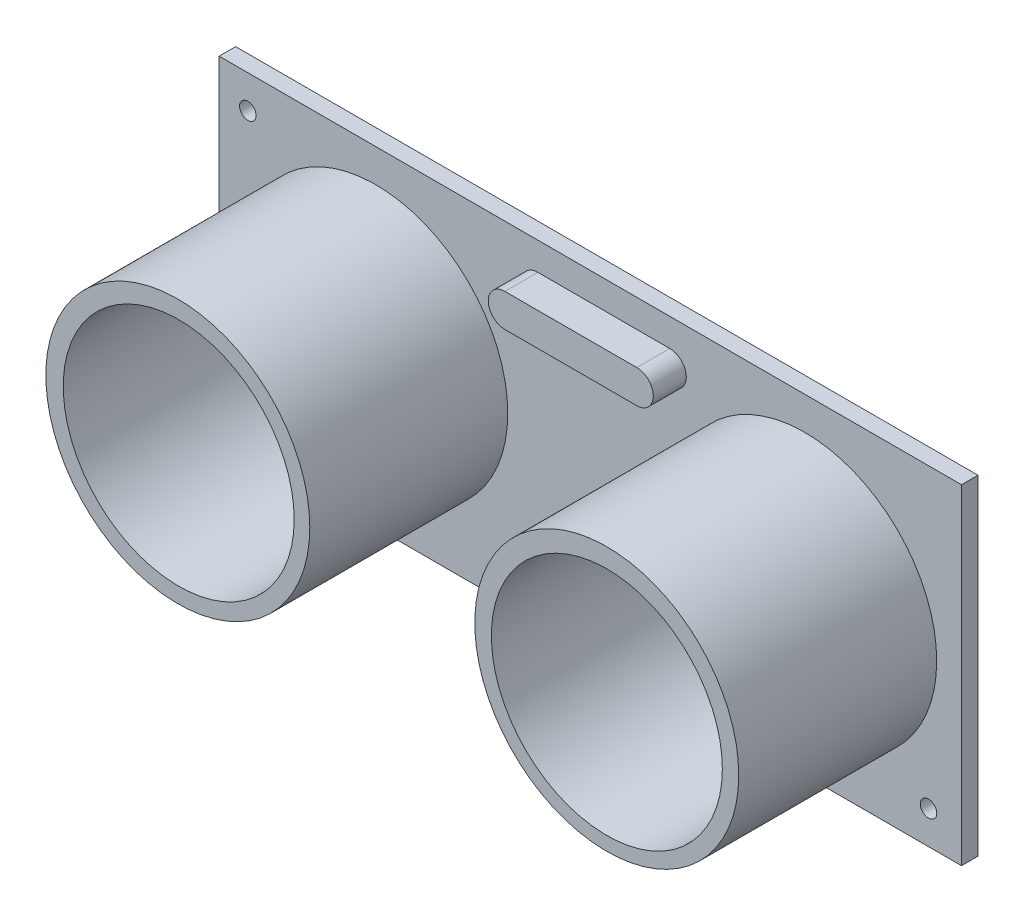
ISO-10303-21;
HEADER;
FILE_DESCRIPTION(('STEP AP214'),'2;1');
FILE_NAME('part.step','',(''),(''),'','','');
FILE_SCHEMA(('AUTOMOTIVE_DESIGN { 1 0 10303 214 1 1 1 1 }'));
ENDSEC;
DATA;
#1=APPLICATION_CONTEXT('core data for automotive mechanical design processes');
#2=APPLICATION_PROTOCOL_DEFINITION('international standard','automotive_design',2000,#1);
#3=PRODUCT_CONTEXT('',#1,'mechanical');
#4=PRODUCT('Part','Part','',(#3));
#5=PRODUCT_RELATED_PRODUCT_CATEGORY('part','',(#4));
#6=PRODUCT_DEFINITION_FORMATION('','',#4);
#7=PRODUCT_DEFINITION_CONTEXT('part definition',#1,'design');
#8=PRODUCT_DEFINITION('design','',#6,#7);
#9=PRODUCT_DEFINITION_SHAPE('','',#8);
#10=(LENGTH_UNIT() NAMED_UNIT(*) SI_UNIT(.MILLI.,.METRE.));
#11=(NAMED_UNIT(*) PLANE_ANGLE_UNIT() SI_UNIT($,.RADIAN.));
#12=(NAMED_UNIT(*) SI_UNIT($,.STERADIAN.) SOLID_ANGLE_UNIT());
#13=UNCERTAINTY_MEASURE_WITH_UNIT(LENGTH_MEASURE(1.E-05),#10,'distance_accuracy_value','');
#14=(GEOMETRIC_REPRESENTATION_CONTEXT(3) GLOBAL_UNCERTAINTY_ASSIGNED_CONTEXT((#13)) GLOBAL_UNIT_ASSIGNED_CONTEXT((#10,
#11,#12)) REPRESENTATION_CONTEXT('',''));
#15=CARTESIAN_POINT('',(0.,0.,0.));
#16=DIRECTION('',(0.,0.,1.));
#17=DIRECTION('',(1.,0.,0.));
#18=AXIS2_PLACEMENT_3D('',#15,#16,#17);
#19=CARTESIAN_POINT('',(0.,0.,1.));
#20=DIRECTION('',(0.,0.,1.));
#21=DIRECTION('',(1.,0.,0.));
#22=AXIS2_PLACEMENT_3D('',#19,#20,#21);
#23=PLANE('',#22);
#24=CARTESIAN_POINT('',(-20.2096892633182,8.39402173913044,1.));
#25=DIRECTION('',(0.,0.,1.));
#26=DIRECTION('',(1.,0.,0.));
#27=AXIS2_PLACEMENT_3D('',#24,#25,#26);
#28=CIRCLE('',#27,0.499999999999999);
#29=CARTESIAN_POINT('',(-19.7096892633182,8.39402173913044,1.));
#30=VERTEX_POINT('',#29);
#31=EDGE_CURVE('E519',#30,#30,#28,.T.);
#32=ORIENTED_EDGE('',*,*,#31,.F.);
#33=EDGE_LOOP('',(#32));
#34=FACE_BOUND('',#33,.T.);
#35=CARTESIAN_POINT('',(21.0502717391304,-7.60597826086956,1.));
#36=DIRECTION('',(0.,0.,1.));
#37=DIRECTION('',(1.,0.,0.));
#38=AXIS2_PLACEMENT_3D('',#35,#36,#37);
#39=CIRCLE('',#38,0.499999999999999);
#40=CARTESIAN_POINT('',(21.5502717391304,-7.60597826086956,1.));
#41=VERTEX_POINT('',#40);
#42=EDGE_CURVE('E513',#41,#41,#39,.T.);
#43=ORIENTED_EDGE('',*,*,#42,.F.);
#44=EDGE_LOOP('',(#43));
#45=FACE_BOUND('',#44,.T.);
#46=CARTESIAN_POINT('',(3.88031665156682,-7.60052573436375,1.));
#47=DIRECTION('',(0.,0.,1.));
#48=DIRECTION('',(1.,0.,0.));
#49=AXIS2_PLACEMENT_3D('',#46,#47,#48);
#50=CIRCLE('',#49,0.91504083453408);
#51=CARTESIAN_POINT('',(4.7953574861009,-7.60052573436375,1.));
#52=VERTEX_POINT('',#51);
#53=EDGE_CURVE('E507',#52,#52,#50,.T.);
#54=ORIENTED_EDGE('',*,*,#53,.F.);
#55=EDGE_LOOP('',(#54));
#56=FACE_BOUND('',#55,.T.);
#57=CARTESIAN_POINT('',(1.38031665156682,-7.60052573436375,1.));
#58=DIRECTION('',(0.,0.,1.));
#59=DIRECTION('',(1.,0.,0.));
#60=AXIS2_PLACEMENT_3D('',#57,#58,#59);
#61=CIRCLE('',#60,1.);
#62=CARTESIAN_POINT('',(2.38031665156682,-7.60052573436375,1.));
#63=VERTEX_POINT('',#62);
#64=EDGE_CURVE('E501',#63,#63,#61,.T.);
#65=ORIENTED_EDGE('',*,*,#64,.F.);
#66=EDGE_LOOP('',(#65));
#67=FACE_BOUND('',#66,.T.);
#68=CARTESIAN_POINT('',(-1.11968334843318,-7.60052573436375,1.));
#69=DIRECTION('',(0.,0.,1.));
#70=DIRECTION('',(1.,0.,0.));
#71=AXIS2_PLACEMENT_3D('',#68,#69,#70);
#72=CIRCLE('',#71,1.);
#73=CARTESIAN_POINT('',(-0.119683348433184,-7.60052573436375,1.));
#74=VERTEX_POINT('',#73);
#75=EDGE_CURVE('E495',#74,#74,#72,.T.);
#76=ORIENTED_EDGE('',*,*,#75,.F.);
#77=EDGE_LOOP('',(#76));
#78=FACE_BOUND('',#77,.T.);
#79=CARTESIAN_POINT('',(-3.61968334843318,-7.60052573436375,1.));
#80=DIRECTION('',(0.,0.,1.));
#81=DIRECTION('',(1.,0.,0.));
#82=AXIS2_PLACEMENT_3D('',#79,#80,#81);
#83=CIRCLE('',#82,1.);
#84=CARTESIAN_POINT('',(-2.61968334843318,-7.60052573436375,1.));
#85=VERTEX_POINT('',#84);
#86=EDGE_CURVE('E488',#85,#85,#83,.T.);
#87=ORIENTED_EDGE('',*,*,#86,.F.);
#88=EDGE_LOOP('',(#87));
#89=FACE_BOUND('',#88,.T.);
#90=CARTESIAN_POINT('',(13.5471158987043,0.394021739130435,1.));
#91=DIRECTION('',(0.,0.,1.));
#92=DIRECTION('',(1.,0.,0.));
#93=AXIS2_PLACEMENT_3D('',#90,#91,#92);
#94=CIRCLE('',#93,8.);
#95=CARTESIAN_POINT('',(21.5471158987044,0.394021739130435,1.));
#96=VERTEX_POINT('',#95);
#97=EDGE_CURVE('E123',#96,#96,#94,.T.);
#98=ORIENTED_EDGE('',*,*,#97,.F.);
#99=EDGE_LOOP('',(#98));
#100=FACE_BOUND('',#99,.T.);
#101=CARTESIAN_POINT('',(-12.4528841012957,0.394021739130435,1.));
#102=DIRECTION('',(0.,0.,1.));
#103=DIRECTION('',(1.,0.,0.));
#104=AXIS2_PLACEMENT_3D('',#101,#102,#103);
#105=CIRCLE('',#104,8.);
#106=CARTESIAN_POINT('',(-4.45288410129565,0.394021739130435,1.));
#107=VERTEX_POINT('',#106);
#108=EDGE_CURVE('E137',#107,#107,#105,.T.);
#109=ORIENTED_EDGE('',*,*,#108,.F.);
#110=EDGE_LOOP('',(#109));
#111=FACE_BOUND('',#110,.T.);
#112=DIRECTION('',(0.,-1.,0.));
#113=VECTOR('',#112,1.);
#114=CARTESIAN_POINT('',(-21.9497282608696,-9.60597826086956,1.));
#115=LINE('',#114,#113);
#116=CARTESIAN_POINT('',(-21.9497282608696,10.3940217391304,1.));
#117=VERTEX_POINT('',#116);
#118=CARTESIAN_POINT('',(-21.9497282608696,-9.60597826086956,1.));
#119=VERTEX_POINT('',#118);
#120=EDGE_CURVE('E144',#117,#119,#115,.T.);
#121=ORIENTED_EDGE('',*,*,#120,.T.);
#122=DIRECTION('',(1.,0.,0.));
#123=VECTOR('',#122,1.);
#124=CARTESIAN_POINT('',(23.0502717391304,-9.60597826086956,1.));
#125=LINE('',#124,#123);
#126=CARTESIAN_POINT('',(23.0502717391304,-9.60597826086956,1.));
#127=VERTEX_POINT('',#126);
#128=EDGE_CURVE('E147',#119,#127,#125,.T.);
#129=ORIENTED_EDGE('',*,*,#128,.T.);
#130=DIRECTION('',(0.,1.,0.));
#131=VECTOR('',#130,1.);
#132=CARTESIAN_POINT('',(23.0502717391304,-9.60597826086956,1.));
#133=LINE('',#132,#131);
#134=CARTESIAN_POINT('',(23.0502717391304,10.3940217391304,1.));
#135=VERTEX_POINT('',#134);
#136=EDGE_CURVE('E150',#127,#135,#133,.T.);
#137=ORIENTED_EDGE('',*,*,#136,.T.);
#138=DIRECTION('',(-1.,0.,0.));
#139=VECTOR('',#138,1.);
#140=CARTESIAN_POINT('',(23.0502717391304,10.3940217391304,1.));
#141=LINE('',#140,#139);
#142=EDGE_CURVE('E152',#135,#117,#141,.T.);
#143=ORIENTED_EDGE('',*,*,#142,.T.);
#144=EDGE_LOOP('',(#121,#129,#137,#143));
#145=FACE_BOUND('',#144,.T.);
#146=DIRECTION('',(1.,0.,0.));
#147=VECTOR('',#146,1.);
#148=CARTESIAN_POINT('',(-2.63096470018747,6.70455111086841,1.));
#149=LINE('',#148,#147);
#150=CARTESIAN_POINT('',(-2.63096470018747,6.70455111086841,1.));
#151=VERTEX_POINT('',#150);
#152=CARTESIAN_POINT('',(5.36903529981253,6.70455111086841,1.));
#153=VERTEX_POINT('',#152);
#154=EDGE_CURVE('E49',#151,#153,#149,.T.);
#155=ORIENTED_EDGE('',*,*,#154,.F.);
#156=CARTESIAN_POINT('',(-2.63096470018747,7.70455111086841,1.));
#157=DIRECTION('',(0.,0.,1.));
#158=DIRECTION('',(1.,0.,0.));
#159=AXIS2_PLACEMENT_3D('',#156,#157,#158);
#160=CIRCLE('',#159,1.);
#161=CARTESIAN_POINT('',(-2.63096470018747,8.70455111086841,1.));
#162=VERTEX_POINT('',#161);
#163=EDGE_CURVE('E119',#162,#151,#160,.T.);
#164=ORIENTED_EDGE('',*,*,#163,.F.);
#165=DIRECTION('',(1.,0.,0.));
#166=VECTOR('',#165,1.);
#167=CARTESIAN_POINT('',(-2.63096470018747,8.70455111086841,1.));
#168=LINE('',#167,#166);
#169=CARTESIAN_POINT('',(5.36903529981253,8.70455111086841,1.));
#170=VERTEX_POINT('',#169);
#171=EDGE_CURVE('E116',#162,#170,#168,.T.);
#172=ORIENTED_EDGE('',*,*,#171,.T.);
#173=CARTESIAN_POINT('',(5.36903529981253,7.70455111086841,1.));
#174=DIRECTION('',(0.,0.,1.));
#175=DIRECTION('',(1.,0.,0.));
#176=AXIS2_PLACEMENT_3D('',#173,#174,#175);
#177=CIRCLE('',#176,1.);
#178=EDGE_CURVE('E54',#153,#170,#177,.T.);
#179=ORIENTED_EDGE('',*,*,#178,.F.);
#180=EDGE_LOOP('',(#155,#164,#172,#179));
#181=FACE_BOUND('',#180,.T.);
#182=ADVANCED_FACE('F34',(#34,#45,#56,#67,#78,#89,#100,#111,#145,#181),#23,.T.);
#183=CARTESIAN_POINT('',(-21.9497282608696,-9.60597826086956,1.));
#184=DIRECTION('',(1.,0.,0.));
#185=DIRECTION('',(0.,0.,-1.));
#186=AXIS2_PLACEMENT_3D('',#183,#184,#185);
#187=PLANE('',#186);
#188=DIRECTION('',(0.,-1.,0.));
#189=VECTOR('',#188,1.);
#190=CARTESIAN_POINT('',(-21.9497282608696,-9.60597826086956,0.));
#191=LINE('',#190,#189);
#192=CARTESIAN_POINT('',(-21.9497282608696,10.3940217391304,0.));
#193=VERTEX_POINT('',#192);
#194=CARTESIAN_POINT('',(-21.9497282608696,-9.60597826086956,0.));
#195=VERTEX_POINT('',#194);
#196=EDGE_CURVE('E141',#193,#195,#191,.T.);
#197=ORIENTED_EDGE('',*,*,#196,.T.);
#198=DIRECTION('',(0.,0.,-1.));
#199=VECTOR('',#198,1.);
#200=CARTESIAN_POINT('',(-21.9497282608696,-9.60597826086956,1.));
#201=LINE('',#200,#199);
#202=EDGE_CURVE('E170',#119,#195,#201,.T.);
#203=ORIENTED_EDGE('',*,*,#202,.F.);
#204=ORIENTED_EDGE('',*,*,#120,.F.);
#205=DIRECTION('',(0.,0.,-1.));
#206=VECTOR('',#205,1.);
#207=CARTESIAN_POINT('',(-21.9497282608696,10.3940217391304,1.));
#208=LINE('',#207,#206);
#209=EDGE_CURVE('E154',#117,#193,#208,.T.);
#210=ORIENTED_EDGE('',*,*,#209,.T.);
#211=EDGE_LOOP('',(#197,#203,#204,#210));
#212=FACE_BOUND('',#211,.T.);
#213=ADVANCED_FACE('F36',(#212),#187,.F.);
#214=CARTESIAN_POINT('',(23.0502717391304,-9.60597826086956,1.));
#215=DIRECTION('',(0.,1.,0.));
#216=DIRECTION('',(-1.,0.,0.));
#217=AXIS2_PLACEMENT_3D('',#214,#215,#216);
#218=PLANE('',#217);
#219=DIRECTION('',(1.,0.,0.));
#220=VECTOR('',#219,1.);
#221=CARTESIAN_POINT('',(23.0502717391304,-9.60597826086956,0.));
#222=LINE('',#221,#220);
#223=CARTESIAN_POINT('',(23.0502717391304,-9.60597826086956,0.));
#224=VERTEX_POINT('',#223);
#225=EDGE_CURVE('E157',#195,#224,#222,.T.);
#226=ORIENTED_EDGE('',*,*,#225,.T.);
#227=DIRECTION('',(0.,0.,-1.));
#228=VECTOR('',#227,1.);
#229=CARTESIAN_POINT('',(23.0502717391304,-9.60597826086956,1.));
#230=LINE('',#229,#228);
#231=EDGE_CURVE('E167',#127,#224,#230,.T.);
#232=ORIENTED_EDGE('',*,*,#231,.F.);
#233=ORIENTED_EDGE('',*,*,#128,.F.);
#234=ORIENTED_EDGE('',*,*,#202,.T.);
#235=EDGE_LOOP('',(#226,#232,#233,#234));
#236=FACE_BOUND('',#235,.T.);
#237=ADVANCED_FACE('F236',(#236),#218,.F.);
#238=CARTESIAN_POINT('',(23.0502717391304,-9.60597826086956,1.));
#239=DIRECTION('',(-1.,0.,0.));
#240=DIRECTION('',(0.,-1.,0.));
#241=AXIS2_PLACEMENT_3D('',#238,#239,#240);
#242=PLANE('',#241);
#243=DIRECTION('',(0.,1.,0.));
#244=VECTOR('',#243,1.);
#245=CARTESIAN_POINT('',(23.0502717391304,-9.60597826086956,0.));
#246=LINE('',#245,#244);
#247=CARTESIAN_POINT('',(23.0502717391304,10.3940217391304,0.));
#248=VERTEX_POINT('',#247);
#249=EDGE_CURVE('E159',#224,#248,#246,.T.);
#250=ORIENTED_EDGE('',*,*,#249,.T.);
#251=DIRECTION('',(0.,0.,-1.));
#252=VECTOR('',#251,1.);
#253=CARTESIAN_POINT('',(23.0502717391304,10.3940217391304,1.));
#254=LINE('',#253,#252);
#255=EDGE_CURVE('E164',#135,#248,#254,.T.);
#256=ORIENTED_EDGE('',*,*,#255,.F.);
#257=ORIENTED_EDGE('',*,*,#136,.F.);
#258=ORIENTED_EDGE('',*,*,#231,.T.);
#259=EDGE_LOOP('',(#250,#256,#257,#258));
#260=FACE_BOUND('',#259,.T.);
#261=ADVANCED_FACE('F241',(#260),#242,.F.);
#262=CARTESIAN_POINT('',(23.0502717391304,10.3940217391304,1.));
#263=DIRECTION('',(0.,-1.,0.));
#264=DIRECTION('',(0.,0.,-1.));
#265=AXIS2_PLACEMENT_3D('',#262,#263,#264);
#266=PLANE('',#265);
#267=DIRECTION('',(-1.,0.,0.));
#268=VECTOR('',#267,1.);
#269=CARTESIAN_POINT('',(23.0502717391304,10.3940217391304,0.));
#270=LINE('',#269,#268);
#271=EDGE_CURVE('E148',#248,#193,#270,.T.);
#272=ORIENTED_EDGE('',*,*,#271,.T.);
#273=ORIENTED_EDGE('',*,*,#209,.F.);
#274=ORIENTED_EDGE('',*,*,#142,.F.);
#275=ORIENTED_EDGE('',*,*,#255,.T.);
#276=EDGE_LOOP('',(#272,#273,#274,#275));
#277=FACE_BOUND('',#276,.T.);
#278=ADVANCED_FACE('F244',(#277),#266,.F.);
#279=CARTESIAN_POINT('',(0.,0.,0.));
#280=DIRECTION('',(0.,0.,1.));
#281=DIRECTION('',(1.,0.,0.));
#282=AXIS2_PLACEMENT_3D('',#279,#280,#281);
#283=PLANE('',#282);
#284=CARTESIAN_POINT('',(-20.2096892633182,8.39402173913044,0.));
#285=DIRECTION('',(0.,0.,1.));
#286=DIRECTION('',(1.,0.,0.));
#287=AXIS2_PLACEMENT_3D('',#284,#285,#286);
#288=CIRCLE('',#287,0.499999999999999);
#289=CARTESIAN_POINT('',(-19.7096892633182,8.39402173913044,0.));
#290=VERTEX_POINT('',#289);
#291=EDGE_CURVE('E510',#290,#290,#288,.T.);
#292=ORIENTED_EDGE('',*,*,#291,.T.);
#293=EDGE_LOOP('',(#292));
#294=FACE_BOUND('',#293,.T.);
#295=CARTESIAN_POINT('',(21.0502717391304,-7.60597826086956,0.));
#296=DIRECTION('',(0.,0.,1.));
#297=DIRECTION('',(1.,0.,0.));
#298=AXIS2_PLACEMENT_3D('',#295,#296,#297);
#299=CIRCLE('',#298,0.499999999999999);
#300=CARTESIAN_POINT('',(21.5502717391304,-7.60597826086956,0.));
#301=VERTEX_POINT('',#300);
#302=EDGE_CURVE('E516',#301,#301,#299,.T.);
#303=ORIENTED_EDGE('',*,*,#302,.T.);
#304=EDGE_LOOP('',(#303));
#305=FACE_BOUND('',#304,.T.);
#306=ORIENTED_EDGE('',*,*,#196,.F.);
#307=ORIENTED_EDGE('',*,*,#271,.F.);
#308=ORIENTED_EDGE('',*,*,#249,.F.);
#309=ORIENTED_EDGE('',*,*,#225,.F.);
#310=EDGE_LOOP('',(#306,#307,#308,#309));
#311=FACE_BOUND('',#310,.T.);
#312=ADVANCED_FACE('F217',(#294,#305,#311),#283,.F.);
#313=CARTESIAN_POINT('',(-12.4528841012957,0.394021739130435,13.));
#314=DIRECTION('',(0.,0.,1.));
#315=DIRECTION('',(1.,0.,0.));
#316=AXIS2_PLACEMENT_3D('',#313,#314,#315);
#317=PLANE('',#316);
#318=CARTESIAN_POINT('',(-12.4528841012957,0.394021739130435,13.));
#319=DIRECTION('',(0.,0.,1.));
#320=DIRECTION('',(1.,0.,0.));
#321=AXIS2_PLACEMENT_3D('',#318,#319,#320);
#322=CIRCLE('',#321,8.);
#323=CARTESIAN_POINT('',(-4.45288410129565,0.394021739130435,13.));
#324=VERTEX_POINT('',#323);
#325=EDGE_CURVE('E138',#324,#324,#322,.T.);
#326=ORIENTED_EDGE('',*,*,#325,.T.);
#327=EDGE_LOOP('',(#326));
#328=FACE_BOUND('',#327,.T.);
#329=CARTESIAN_POINT('',(-12.3981339714412,0.33927160927601,13.));
#330=DIRECTION('',(0.,0.,1.));
#331=DIRECTION('',(1.,0.,0.));
#332=AXIS2_PLACEMENT_3D('',#329,#330,#331);
#333=CIRCLE('',#332,7.);
#334=CARTESIAN_POINT('',(-5.39813397144122,0.33927160927601,13.));
#335=VERTEX_POINT('',#334);
#336=EDGE_CURVE('E132',#335,#335,#333,.T.);
#337=ORIENTED_EDGE('',*,*,#336,.F.);
#338=EDGE_LOOP('',(#337));
#339=FACE_BOUND('',#338,.T.);
#340=ADVANCED_FACE('F215',(#328,#339),#317,.T.);
#341=CARTESIAN_POINT('',(-12.4528841012957,0.394021739130435,13.));
#342=DIRECTION('',(0.,0.,-1.));
#343=DIRECTION('',(-1.,0.,0.));
#344=AXIS2_PLACEMENT_3D('',#341,#342,#343);
#345=CYLINDRICAL_SURFACE('',#344,8.);
#346=ORIENTED_EDGE('',*,*,#325,.F.);
#347=EDGE_LOOP('',(#346));
#348=FACE_BOUND('',#347,.T.);
#349=ORIENTED_EDGE('',*,*,#108,.T.);
#350=EDGE_LOOP('',(#349));
#351=FACE_BOUND('',#350,.T.);
#352=ADVANCED_FACE('F189',(#348,#351),#345,.T.);
#353=CARTESIAN_POINT('',(-12.3981339714412,0.33927160927601,13.));
#354=DIRECTION('',(0.,0.,-1.));
#355=DIRECTION('',(-1.,0.,0.));
#356=AXIS2_PLACEMENT_3D('',#353,#354,#355);
#357=CYLINDRICAL_SURFACE('',#356,7.);
#358=ORIENTED_EDGE('',*,*,#336,.T.);
#359=EDGE_LOOP('',(#358));
#360=FACE_BOUND('',#359,.T.);
#361=CARTESIAN_POINT('',(-12.3981339714412,0.33927160927601,1.));
#362=DIRECTION('',(0.,0.,1.));
#363=DIRECTION('',(1.,0.,0.));
#364=AXIS2_PLACEMENT_3D('',#361,#362,#363);
#365=CIRCLE('',#364,7.);
#366=CARTESIAN_POINT('',(-5.39813397144122,0.33927160927601,1.));
#367=VERTEX_POINT('',#366);
#368=EDGE_CURVE('E42',#367,#367,#365,.F.);
#369=ORIENTED_EDGE('',*,*,#368,.T.);
#370=EDGE_LOOP('',(#369));
#371=FACE_BOUND('',#370,.T.);
#372=ADVANCED_FACE('F175',(#360,#371),#357,.F.);
#373=ORIENTED_EDGE('',*,*,#368,.F.);
#374=EDGE_LOOP('',(#373));
#375=FACE_BOUND('',#374,.T.);
#376=ADVANCED_FACE('F177',(#375),#23,.T.);
#377=CARTESIAN_POINT('',(13.5471158987043,0.394021739130435,13.));
#378=DIRECTION('',(0.,0.,1.));
#379=DIRECTION('',(1.,0.,0.));
#380=AXIS2_PLACEMENT_3D('',#377,#378,#379);
#381=PLANE('',#380);
#382=CARTESIAN_POINT('',(13.5471158987043,0.394021739130435,13.));
#383=DIRECTION('',(0.,0.,1.));
#384=DIRECTION('',(1.,0.,0.));
#385=AXIS2_PLACEMENT_3D('',#382,#383,#384);
#386=CIRCLE('',#385,8.);
#387=CARTESIAN_POINT('',(21.5471158987044,0.394021739130435,13.));
#388=VERTEX_POINT('',#387);
#389=EDGE_CURVE('E129',#388,#388,#386,.T.);
#390=ORIENTED_EDGE('',*,*,#389,.T.);
#391=EDGE_LOOP('',(#390));
#392=FACE_BOUND('',#391,.T.);
#393=CARTESIAN_POINT('',(13.5534275795565,0.22977134956716,13.));
#394=DIRECTION('',(0.,0.,1.));
#395=DIRECTION('',(1.,0.,0.));
#396=AXIS2_PLACEMENT_3D('',#393,#394,#395);
#397=CIRCLE('',#396,7.);
#398=CARTESIAN_POINT('',(20.5534275795565,0.22977134956716,13.));
#399=VERTEX_POINT('',#398);
#400=EDGE_CURVE('E120',#399,#399,#397,.T.);
#401=ORIENTED_EDGE('',*,*,#400,.F.);
#402=EDGE_LOOP('',(#401));
#403=FACE_BOUND('',#402,.T.);
#404=ADVANCED_FACE('F179',(#392,#403),#381,.T.);
#405=CARTESIAN_POINT('',(13.5471158987043,0.394021739130435,13.));
#406=DIRECTION('',(0.,0.,-1.));
#407=DIRECTION('',(-1.,0.,0.));
#408=AXIS2_PLACEMENT_3D('',#405,#406,#407);
#409=CYLINDRICAL_SURFACE('',#408,8.);
#410=ORIENTED_EDGE('',*,*,#389,.F.);
#411=EDGE_LOOP('',(#410));
#412=FACE_BOUND('',#411,.T.);
#413=ORIENTED_EDGE('',*,*,#97,.T.);
#414=EDGE_LOOP('',(#413));
#415=FACE_BOUND('',#414,.T.);
#416=ADVANCED_FACE('F186',(#412,#415),#409,.T.);
#417=CARTESIAN_POINT('',(13.5534275795565,0.22977134956716,13.));
#418=DIRECTION('',(0.,0.,-1.));
#419=DIRECTION('',(-1.,0.,0.));
#420=AXIS2_PLACEMENT_3D('',#417,#418,#419);
#421=CYLINDRICAL_SURFACE('',#420,7.);
#422=ORIENTED_EDGE('',*,*,#400,.T.);
#423=EDGE_LOOP('',(#422));
#424=FACE_BOUND('',#423,.T.);
#425=CARTESIAN_POINT('',(13.5534275795565,0.22977134956716,1.));
#426=DIRECTION('',(0.,0.,1.));
#427=DIRECTION('',(1.,0.,0.));
#428=AXIS2_PLACEMENT_3D('',#425,#426,#427);
#429=CIRCLE('',#428,7.);
#430=CARTESIAN_POINT('',(20.5534275795565,0.22977134956716,1.));
#431=VERTEX_POINT('',#430);
#432=EDGE_CURVE('E11',#431,#431,#429,.F.);
#433=ORIENTED_EDGE('',*,*,#432,.T.);
#434=EDGE_LOOP('',(#433));
#435=FACE_BOUND('',#434,.T.);
#436=ADVANCED_FACE('F197',(#424,#435),#421,.F.);
#437=ORIENTED_EDGE('',*,*,#432,.F.);
#438=EDGE_LOOP('',(#437));
#439=FACE_BOUND('',#438,.T.);
#440=ADVANCED_FACE('F181',(#439),#23,.T.);
#441=CARTESIAN_POINT('',(-2.63096470018747,7.70455111086841,3.));
#442=DIRECTION('',(0.,0.,-1.));
#443=DIRECTION('',(-1.,0.,0.));
#444=AXIS2_PLACEMENT_3D('',#441,#442,#443);
#445=CYLINDRICAL_SURFACE('',#444,1.);
#446=ORIENTED_EDGE('',*,*,#163,.T.);
#447=DIRECTION('',(0.,0.,-1.));
#448=VECTOR('',#447,1.);
#449=CARTESIAN_POINT('',(-2.63096470018747,6.70455111086841,3.));
#450=LINE('',#449,#448);
#451=CARTESIAN_POINT('',(-2.63096470018747,6.70455111086841,3.));
#452=VERTEX_POINT('',#451);
#453=EDGE_CURVE('E100',#452,#151,#450,.T.);
#454=ORIENTED_EDGE('',*,*,#453,.F.);
#455=CARTESIAN_POINT('',(-2.63096470018747,7.70455111086841,3.));
#456=DIRECTION('',(0.,0.,1.));
#457=DIRECTION('',(1.,0.,0.));
#458=AXIS2_PLACEMENT_3D('',#455,#456,#457);
#459=CIRCLE('',#458,1.);
#460=CARTESIAN_POINT('',(-2.63096470018747,8.70455111086841,3.));
#461=VERTEX_POINT('',#460);
#462=EDGE_CURVE('E107',#461,#452,#459,.T.);
#463=ORIENTED_EDGE('',*,*,#462,.F.);
#464=DIRECTION('',(0.,0.,-1.));
#465=VECTOR('',#464,1.);
#466=CARTESIAN_POINT('',(-2.63096470018747,8.70455111086841,3.));
#467=LINE('',#466,#465);
#468=EDGE_CURVE('E482',#461,#162,#467,.T.);
#469=ORIENTED_EDGE('',*,*,#468,.T.);
#470=EDGE_LOOP('',(#446,#454,#463,#469));
#471=FACE_BOUND('',#470,.T.);
#472=ADVANCED_FACE('F118',(#471),#445,.T.);
#473=CARTESIAN_POINT('',(-2.63096470018747,6.70455111086841,3.));
#474=DIRECTION('',(0.,1.,0.));
#475=DIRECTION('',(0.,0.,1.));
#476=AXIS2_PLACEMENT_3D('',#473,#474,#475);
#477=PLANE('',#476);
#478=ORIENTED_EDGE('',*,*,#154,.T.);
#479=DIRECTION('',(0.,0.,-1.));
#480=VECTOR('',#479,1.);
#481=CARTESIAN_POINT('',(5.36903529981253,6.70455111086841,3.));
#482=LINE('',#481,#480);
#483=CARTESIAN_POINT('',(5.36903529981253,6.70455111086841,3.));
#484=VERTEX_POINT('',#483);
#485=EDGE_CURVE('E103',#484,#153,#482,.T.);
#486=ORIENTED_EDGE('',*,*,#485,.F.);
#487=DIRECTION('',(1.,0.,0.));
#488=VECTOR('',#487,1.);
#489=CARTESIAN_POINT('',(-2.63096470018747,6.70455111086841,3.));
#490=LINE('',#489,#488);
#491=EDGE_CURVE('E96',#452,#484,#490,.T.);
#492=ORIENTED_EDGE('',*,*,#491,.F.);
#493=ORIENTED_EDGE('',*,*,#453,.T.);
#494=EDGE_LOOP('',(#478,#486,#492,#493));
#495=FACE_BOUND('',#494,.T.);
#496=ADVANCED_FACE('F98',(#495),#477,.F.);
#497=CARTESIAN_POINT('',(5.36903529981253,7.70455111086841,3.));
#498=DIRECTION('',(0.,0.,-1.));
#499=DIRECTION('',(-1.,0.,0.));
#500=AXIS2_PLACEMENT_3D('',#497,#498,#499);
#501=CYLINDRICAL_SURFACE('',#500,1.);
#502=ORIENTED_EDGE('',*,*,#178,.T.);
#503=DIRECTION('',(0.,0.,-1.));
#504=VECTOR('',#503,1.);
#505=CARTESIAN_POINT('',(5.36903529981253,8.70455111086841,3.));
#506=LINE('',#505,#504);
#507=CARTESIAN_POINT('',(5.36903529981253,8.70455111086841,3.));
#508=VERTEX_POINT('',#507);
#509=EDGE_CURVE('E125',#508,#170,#506,.T.);
#510=ORIENTED_EDGE('',*,*,#509,.F.);
#511=CARTESIAN_POINT('',(5.36903529981253,7.70455111086841,3.));
#512=DIRECTION('',(0.,0.,1.));
#513=DIRECTION('',(1.,0.,0.));
#514=AXIS2_PLACEMENT_3D('',#511,#512,#513);
#515=CIRCLE('',#514,1.);
#516=EDGE_CURVE('E106',#484,#508,#515,.T.);
#517=ORIENTED_EDGE('',*,*,#516,.F.);
#518=ORIENTED_EDGE('',*,*,#485,.T.);
#519=EDGE_LOOP('',(#502,#510,#517,#518));
#520=FACE_BOUND('',#519,.T.);
#521=ADVANCED_FACE('F342',(#520),#501,.T.);
#522=CARTESIAN_POINT('',(-2.63096470018747,8.70455111086841,3.));
#523=DIRECTION('',(0.,1.,0.));
#524=DIRECTION('',(0.,0.,1.));
#525=AXIS2_PLACEMENT_3D('',#522,#523,#524);
#526=PLANE('',#525);
#527=ORIENTED_EDGE('',*,*,#171,.F.);
#528=ORIENTED_EDGE('',*,*,#468,.F.);
#529=DIRECTION('',(1.,0.,0.));
#530=VECTOR('',#529,1.);
#531=CARTESIAN_POINT('',(-2.63096470018747,8.70455111086841,3.));
#532=LINE('',#531,#530);
#533=EDGE_CURVE('E113',#461,#508,#532,.T.);
#534=ORIENTED_EDGE('',*,*,#533,.T.);
#535=ORIENTED_EDGE('',*,*,#509,.T.);
#536=EDGE_LOOP('',(#527,#528,#534,#535));
#537=FACE_BOUND('',#536,.T.);
#538=ADVANCED_FACE('F339',(#537),#526,.T.);
#539=CARTESIAN_POINT('',(-2.63096470018747,7.70455111086841,3.));
#540=DIRECTION('',(0.,0.,1.));
#541=DIRECTION('',(1.,0.,0.));
#542=AXIS2_PLACEMENT_3D('',#539,#540,#541);
#543=PLANE('',#542);
#544=ORIENTED_EDGE('',*,*,#462,.T.);
#545=ORIENTED_EDGE('',*,*,#491,.T.);
#546=ORIENTED_EDGE('',*,*,#516,.T.);
#547=ORIENTED_EDGE('',*,*,#533,.F.);
#548=EDGE_LOOP('',(#544,#545,#546,#547));
#549=FACE_BOUND('',#548,.T.);
#550=ADVANCED_FACE('F111',(#549),#543,.T.);
#551=CARTESIAN_POINT('',(-3.61968334843318,-7.60052573436375,2.));
#552=DIRECTION('',(0.,0.,-1.));
#553=DIRECTION('',(-1.,0.,0.));
#554=AXIS2_PLACEMENT_3D('',#551,#552,#553);
#555=CYLINDRICAL_SURFACE('',#554,1.);
#556=CARTESIAN_POINT('',(-3.61968334843318,-7.60052573436375,2.));
#557=DIRECTION('',(0.,0.,1.));
#558=DIRECTION('',(1.,0.,0.));
#559=AXIS2_PLACEMENT_3D('',#556,#557,#558);
#560=CIRCLE('',#559,1.);
#561=CARTESIAN_POINT('',(-2.61968334843318,-7.60052573436375,2.));
#562=VERTEX_POINT('',#561);
#563=EDGE_CURVE('E486',#562,#562,#560,.T.);
#564=ORIENTED_EDGE('',*,*,#563,.F.);
#565=EDGE_LOOP('',(#564));
#566=FACE_BOUND('',#565,.T.);
#567=ORIENTED_EDGE('',*,*,#86,.T.);
#568=EDGE_LOOP('',(#567));
#569=FACE_BOUND('',#568,.T.);
#570=ADVANCED_FACE('F332',(#566,#569),#555,.T.);
#571=CARTESIAN_POINT('',(-3.61968334843318,-7.60052573436375,2.));
#572=DIRECTION('',(0.,0.,1.));
#573=DIRECTION('',(1.,0.,0.));
#574=AXIS2_PLACEMENT_3D('',#571,#572,#573);
#575=PLANE('',#574);
#576=ORIENTED_EDGE('',*,*,#563,.T.);
#577=EDGE_LOOP('',(#576));
#578=FACE_BOUND('',#577,.T.);
#579=ADVANCED_FACE('F328',(#578),#575,.T.);
#580=CARTESIAN_POINT('',(-1.11968334843318,-7.60052573436375,2.));
#581=DIRECTION('',(0.,0.,-1.));
#582=DIRECTION('',(-1.,0.,0.));
#583=AXIS2_PLACEMENT_3D('',#580,#581,#582);
#584=CYLINDRICAL_SURFACE('',#583,1.);
#585=CARTESIAN_POINT('',(-1.11968334843318,-7.60052573436375,2.));
#586=DIRECTION('',(0.,0.,1.));
#587=DIRECTION('',(1.,0.,0.));
#588=AXIS2_PLACEMENT_3D('',#585,#586,#587);
#589=CIRCLE('',#588,1.);
#590=CARTESIAN_POINT('',(-0.119683348433184,-7.60052573436375,2.));
#591=VERTEX_POINT('',#590);
#592=EDGE_CURVE('E492',#591,#591,#589,.T.);
#593=ORIENTED_EDGE('',*,*,#592,.F.);
#594=EDGE_LOOP('',(#593));
#595=FACE_BOUND('',#594,.T.);
#596=ORIENTED_EDGE('',*,*,#75,.T.);
#597=EDGE_LOOP('',(#596));
#598=FACE_BOUND('',#597,.T.);
#599=ADVANCED_FACE('F324',(#595,#598),#584,.T.);
#600=CARTESIAN_POINT('',(-1.11968334843318,-7.60052573436375,2.));
#601=DIRECTION('',(0.,0.,1.));
#602=DIRECTION('',(1.,0.,0.));
#603=AXIS2_PLACEMENT_3D('',#600,#601,#602);
#604=PLANE('',#603);
#605=ORIENTED_EDGE('',*,*,#592,.T.);
#606=EDGE_LOOP('',(#605));
#607=FACE_BOUND('',#606,.T.);
#608=ADVANCED_FACE('F320',(#607),#604,.T.);
#609=CARTESIAN_POINT('',(1.38031665156682,-7.60052573436375,2.));
#610=DIRECTION('',(0.,0.,-1.));
#611=DIRECTION('',(-1.,0.,0.));
#612=AXIS2_PLACEMENT_3D('',#609,#610,#611);
#613=CYLINDRICAL_SURFACE('',#612,1.);
#614=CARTESIAN_POINT('',(1.38031665156682,-7.60052573436375,2.));
#615=DIRECTION('',(0.,0.,1.));
#616=DIRECTION('',(1.,0.,0.));
#617=AXIS2_PLACEMENT_3D('',#614,#615,#616);
#618=CIRCLE('',#617,1.);
#619=CARTESIAN_POINT('',(2.38031665156682,-7.60052573436375,2.));
#620=VERTEX_POINT('',#619);
#621=EDGE_CURVE('E498',#620,#620,#618,.T.);
#622=ORIENTED_EDGE('',*,*,#621,.F.);
#623=EDGE_LOOP('',(#622));
#624=FACE_BOUND('',#623,.T.);
#625=ORIENTED_EDGE('',*,*,#64,.T.);
#626=EDGE_LOOP('',(#625));
#627=FACE_BOUND('',#626,.T.);
#628=ADVANCED_FACE('F316',(#624,#627),#613,.T.);
#629=CARTESIAN_POINT('',(1.38031665156682,-7.60052573436375,2.));
#630=DIRECTION('',(0.,0.,1.));
#631=DIRECTION('',(1.,0.,0.));
#632=AXIS2_PLACEMENT_3D('',#629,#630,#631);
#633=PLANE('',#632);
#634=ORIENTED_EDGE('',*,*,#621,.T.);
#635=EDGE_LOOP('',(#634));
#636=FACE_BOUND('',#635,.T.);
#637=ADVANCED_FACE('F312',(#636),#633,.T.);
#638=CARTESIAN_POINT('',(3.88031665156682,-7.60052573436375,2.));
#639=DIRECTION('',(0.,0.,-1.));
#640=DIRECTION('',(-1.,0.,0.));
#641=AXIS2_PLACEMENT_3D('',#638,#639,#640);
#642=CYLINDRICAL_SURFACE('',#641,0.91504083453408);
#643=CARTESIAN_POINT('',(3.88031665156682,-7.60052573436375,2.));
#644=DIRECTION('',(0.,0.,1.));
#645=DIRECTION('',(1.,0.,0.));
#646=AXIS2_PLACEMENT_3D('',#643,#644,#645);
#647=CIRCLE('',#646,0.91504083453408);
#648=CARTESIAN_POINT('',(4.7953574861009,-7.60052573436375,2.));
#649=VERTEX_POINT('',#648);
#650=EDGE_CURVE('E504',#649,#649,#647,.T.);
#651=ORIENTED_EDGE('',*,*,#650,.F.);
#652=EDGE_LOOP('',(#651));
#653=FACE_BOUND('',#652,.T.);
#654=ORIENTED_EDGE('',*,*,#53,.T.);
#655=EDGE_LOOP('',(#654));
#656=FACE_BOUND('',#655,.T.);
#657=ADVANCED_FACE('F308',(#653,#656),#642,.T.);
#658=CARTESIAN_POINT('',(3.88031665156682,-7.60052573436375,2.));
#659=DIRECTION('',(0.,0.,1.));
#660=DIRECTION('',(1.,0.,0.));
#661=AXIS2_PLACEMENT_3D('',#658,#659,#660);
#662=PLANE('',#661);
#663=ORIENTED_EDGE('',*,*,#650,.T.);
#664=EDGE_LOOP('',(#663));
#665=FACE_BOUND('',#664,.T.);
#666=ADVANCED_FACE('F273',(#665),#662,.T.);
#667=CARTESIAN_POINT('',(21.0502717391304,-7.60597826086956,0.));
#668=DIRECTION('',(0.,0.,1.));
#669=DIRECTION('',(1.,0.,0.));
#670=AXIS2_PLACEMENT_3D('',#667,#668,#669);
#671=CYLINDRICAL_SURFACE('',#670,0.499999999999999);
#672=ORIENTED_EDGE('',*,*,#302,.F.);
#673=EDGE_LOOP('',(#672));
#674=FACE_BOUND('',#673,.T.);
#675=ORIENTED_EDGE('',*,*,#42,.T.);
#676=EDGE_LOOP('',(#675));
#677=FACE_BOUND('',#676,.T.);
#678=ADVANCED_FACE('F285',(#674,#677),#671,.F.);
#679=CARTESIAN_POINT('',(-20.2096892633182,8.39402173913044,0.));
#680=DIRECTION('',(0.,0.,1.));
#681=DIRECTION('',(1.,0.,0.));
#682=AXIS2_PLACEMENT_3D('',#679,#680,#681);
#683=CYLINDRICAL_SURFACE('',#682,0.499999999999999);
#684=ORIENTED_EDGE('',*,*,#291,.F.);
#685=EDGE_LOOP('',(#684));
#686=FACE_BOUND('',#685,.T.);
#687=ORIENTED_EDGE('',*,*,#31,.T.);
#688=EDGE_LOOP('',(#687));
#689=FACE_BOUND('',#688,.T.);
#690=ADVANCED_FACE('F290',(#686,#689),#683,.F.);
#691=CLOSED_SHELL('',(#182,#213,#237,#261,#278,#312,#340,#352,#372,#376,#404,#416,#436,#440,
#472,#496,#521,#538,#550,#570,#579,#599,#608,#628,#637,#657,#666,#678,#690));
#692=MANIFOLD_SOLID_BREP('B2',#691);
#693=ADVANCED_BREP_SHAPE_REPRESENTATION('',(#18,#692),#14);
#694=SHAPE_DEFINITION_REPRESENTATION(#9,#693);
ENDSEC;
END-ISO-10303-21;
